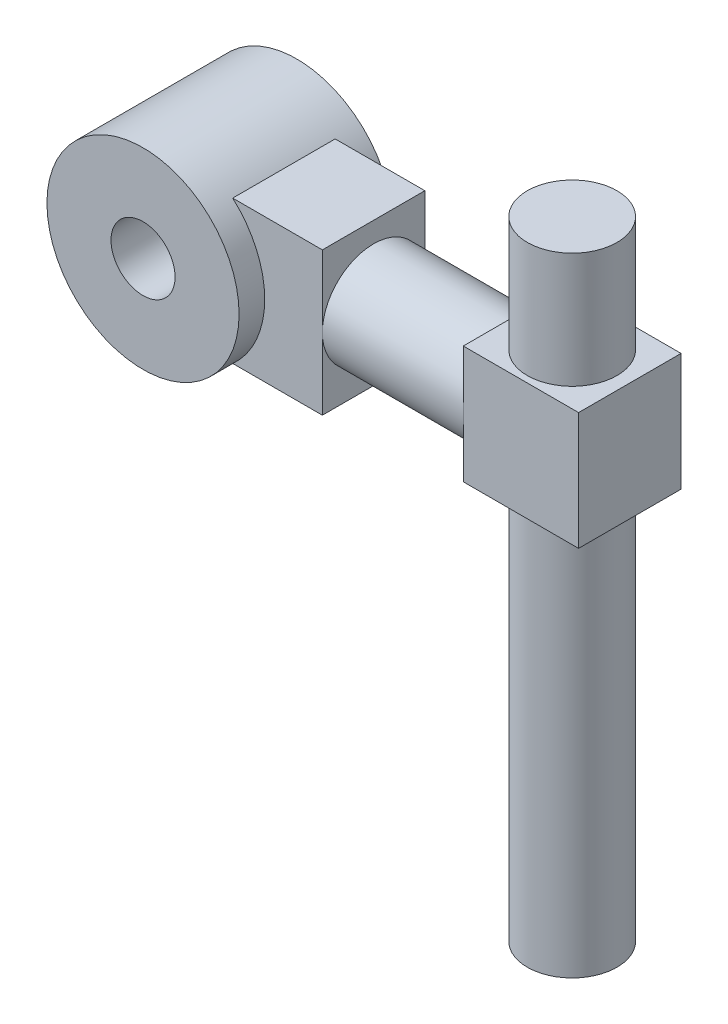
ISO-10303-21;
HEADER;
FILE_DESCRIPTION(('STEP AP214'),'2;1');
FILE_NAME('part.step','',(''),(''),'','','');
FILE_SCHEMA(('AUTOMOTIVE_DESIGN { 1 0 10303 214 1 1 1 1 }'));
ENDSEC;
DATA;
#1=APPLICATION_CONTEXT('core data for automotive mechanical design processes');
#2=APPLICATION_PROTOCOL_DEFINITION('international standard','automotive_design',2000,#1);
#3=PRODUCT_CONTEXT('',#1,'mechanical');
#4=PRODUCT('Part','Part','',(#3));
#5=PRODUCT_RELATED_PRODUCT_CATEGORY('part','',(#4));
#6=PRODUCT_DEFINITION_FORMATION('','',#4);
#7=PRODUCT_DEFINITION_CONTEXT('part definition',#1,'design');
#8=PRODUCT_DEFINITION('design','',#6,#7);
#9=PRODUCT_DEFINITION_SHAPE('','',#8);
#10=(LENGTH_UNIT() NAMED_UNIT(*) SI_UNIT(.MILLI.,.METRE.));
#11=(NAMED_UNIT(*) PLANE_ANGLE_UNIT() SI_UNIT($,.RADIAN.));
#12=(NAMED_UNIT(*) SI_UNIT($,.STERADIAN.) SOLID_ANGLE_UNIT());
#13=UNCERTAINTY_MEASURE_WITH_UNIT(LENGTH_MEASURE(1.E-05),#10,'distance_accuracy_value','');
#14=(GEOMETRIC_REPRESENTATION_CONTEXT(3) GLOBAL_UNCERTAINTY_ASSIGNED_CONTEXT((#13)) GLOBAL_UNIT_ASSIGNED_CONTEXT((#10,
#11,#12)) REPRESENTATION_CONTEXT('',''));
#15=CARTESIAN_POINT('',(0.,0.,0.));
#16=DIRECTION('',(0.,0.,1.));
#17=DIRECTION('',(1.,0.,0.));
#18=AXIS2_PLACEMENT_3D('',#15,#16,#17);
#19=CARTESIAN_POINT('',(60.,0.,0.));
#20=DIRECTION('',(1.,0.,0.));
#21=DIRECTION('',(0.,1.,0.));
#22=AXIS2_PLACEMENT_3D('',#19,#20,#21);
#23=PLANE('',#22);
#24=CARTESIAN_POINT('',(60.,0.,30.));
#25=DIRECTION('',(1.,0.,0.));
#26=DIRECTION('',(0.,1.,0.));
#27=AXIS2_PLACEMENT_3D('',#24,#25,#26);
#28=CIRCLE('',#27,20.);
#29=CARTESIAN_POINT('',(60.,0.,50.));
#30=VERTEX_POINT('',#29);
#31=CARTESIAN_POINT('',(60.,0.,10.));
#32=VERTEX_POINT('',#31);
#33=EDGE_CURVE('E53',#30,#32,#28,.T.);
#34=ORIENTED_EDGE('',*,*,#33,.F.);
#35=DIRECTION('',(0.,-1.,0.));
#36=VECTOR('',#35,1.);
#37=CARTESIAN_POINT('',(60.,27.9508497187474,50.));
#38=LINE('',#37,#36);
#39=CARTESIAN_POINT('',(60.,-27.9508497187474,50.));
#40=VERTEX_POINT('',#39);
#41=EDGE_CURVE('E159',#30,#40,#38,.T.);
#42=ORIENTED_EDGE('',*,*,#41,.T.);
#43=DIRECTION('',(0.,0.,-1.));
#44=VECTOR('',#43,1.);
#45=CARTESIAN_POINT('',(60.,-27.9508497187474,50.));
#46=LINE('',#45,#44);
#47=CARTESIAN_POINT('',(60.,-27.9508497187474,10.));
#48=VERTEX_POINT('',#47);
#49=EDGE_CURVE('E164',#40,#48,#46,.T.);
#50=ORIENTED_EDGE('',*,*,#49,.T.);
#51=DIRECTION('',(0.,1.,0.));
#52=VECTOR('',#51,1.);
#53=CARTESIAN_POINT('',(60.,27.9508497187474,10.));
#54=LINE('',#53,#52);
#55=EDGE_CURVE('E168',#48,#32,#54,.T.);
#56=ORIENTED_EDGE('',*,*,#55,.T.);
#57=EDGE_LOOP('',(#34,#42,#50,#56));
#58=FACE_BOUND('',#57,.T.);
#59=ADVANCED_FACE('F41',(#58),#23,.T.);
#60=CARTESIAN_POINT('',(0.,0.,0.));
#61=DIRECTION('',(0.,0.,1.));
#62=DIRECTION('',(1.,0.,0.));
#63=AXIS2_PLACEMENT_3D('',#60,#61,#62);
#64=PLANE('',#63);
#65=CARTESIAN_POINT('',(0.,0.,0.));
#66=DIRECTION('',(0.,0.,1.));
#67=DIRECTION('',(1.,0.,0.));
#68=AXIS2_PLACEMENT_3D('',#65,#66,#67);
#69=CIRCLE('',#68,37.5);
#70=CARTESIAN_POINT('',(37.5,0.,0.));
#71=VERTEX_POINT('',#70);
#72=EDGE_CURVE('E213',#71,#71,#69,.T.);
#73=ORIENTED_EDGE('',*,*,#72,.F.);
#74=EDGE_LOOP('',(#73));
#75=FACE_BOUND('',#74,.T.);
#76=CARTESIAN_POINT('',(0.,0.,0.));
#77=DIRECTION('',(0.,0.,1.));
#78=DIRECTION('',(1.,0.,0.));
#79=AXIS2_PLACEMENT_3D('',#76,#77,#78);
#80=CIRCLE('',#79,12.5);
#81=CARTESIAN_POINT('',(12.5,0.,0.));
#82=VERTEX_POINT('',#81);
#83=EDGE_CURVE('E209',#82,#82,#80,.T.);
#84=ORIENTED_EDGE('',*,*,#83,.T.);
#85=EDGE_LOOP('',(#84));
#86=FACE_BOUND('',#85,.T.);
#87=ADVANCED_FACE('F222',(#75,#86),#64,.F.);
#88=CARTESIAN_POINT('',(0.,0.,10.));
#89=DIRECTION('',(0.,0.,-1.));
#90=DIRECTION('',(-1.,0.,0.));
#91=AXIS2_PLACEMENT_3D('',#88,#89,#90);
#92=CYLINDRICAL_SURFACE('',#91,37.5);
#93=CARTESIAN_POINT('',(0.,0.,10.));
#94=DIRECTION('',(0.,0.,1.));
#95=DIRECTION('',(1.,0.,0.));
#96=AXIS2_PLACEMENT_3D('',#93,#94,#95);
#97=CIRCLE('',#96,37.5);
#98=CARTESIAN_POINT('',(25.,-27.9508497187474,10.));
#99=VERTEX_POINT('',#98);
#100=CARTESIAN_POINT('',(25.,27.9508497187474,10.));
#101=VERTEX_POINT('',#100);
#102=EDGE_CURVE('E51',#99,#101,#97,.T.);
#103=ORIENTED_EDGE('',*,*,#102,.F.);
#104=DIRECTION('',(0.,0.,-1.));
#105=VECTOR('',#104,1.);
#106=CARTESIAN_POINT('',(25.,-27.9508497187474,50.));
#107=LINE('',#106,#105);
#108=CARTESIAN_POINT('',(25.,-27.9508497187474,50.));
#109=VERTEX_POINT('',#108);
#110=EDGE_CURVE('E206',#109,#99,#107,.T.);
#111=ORIENTED_EDGE('',*,*,#110,.F.);
#112=CARTESIAN_POINT('',(0.,0.,50.));
#113=DIRECTION('',(0.,0.,1.));
#114=DIRECTION('',(1.,0.,0.));
#115=AXIS2_PLACEMENT_3D('',#112,#113,#114);
#116=CIRCLE('',#115,37.5);
#117=CARTESIAN_POINT('',(25.,27.9508497187474,50.));
#118=VERTEX_POINT('',#117);
#119=EDGE_CURVE('E194',#109,#118,#116,.T.);
#120=ORIENTED_EDGE('',*,*,#119,.T.);
#121=DIRECTION('',(0.,0.,-1.));
#122=VECTOR('',#121,1.);
#123=CARTESIAN_POINT('',(25.,27.9508497187474,50.));
#124=LINE('',#123,#122);
#125=EDGE_CURVE('E199',#118,#101,#124,.T.);
#126=ORIENTED_EDGE('',*,*,#125,.T.);
#127=EDGE_LOOP('',(#103,#111,#120,#126));
#128=FACE_BOUND('',#127,.T.);
#129=ORIENTED_EDGE('',*,*,#72,.T.);
#130=EDGE_LOOP('',(#129));
#131=FACE_BOUND('',#130,.T.);
#132=CARTESIAN_POINT('',(0.,0.,60.));
#133=DIRECTION('',(0.,0.,1.));
#134=DIRECTION('',(1.,0.,0.));
#135=AXIS2_PLACEMENT_3D('',#132,#133,#134);
#136=CIRCLE('',#135,37.5);
#137=CARTESIAN_POINT('',(37.5,0.,60.));
#138=VERTEX_POINT('',#137);
#139=EDGE_CURVE('E195',#138,#138,#136,.T.);
#140=ORIENTED_EDGE('',*,*,#139,.F.);
#141=EDGE_LOOP('',(#140));
#142=FACE_BOUND('',#141,.T.);
#143=ADVANCED_FACE('F43',(#128,#131,#142),#92,.T.);
#144=CARTESIAN_POINT('',(0.,0.,10.));
#145=DIRECTION('',(0.,0.,-1.));
#146=DIRECTION('',(-1.,0.,0.));
#147=AXIS2_PLACEMENT_3D('',#144,#145,#146);
#148=CYLINDRICAL_SURFACE('',#147,12.5);
#149=ORIENTED_EDGE('',*,*,#83,.F.);
#150=EDGE_LOOP('',(#149));
#151=FACE_BOUND('',#150,.T.);
#152=CARTESIAN_POINT('',(0.,0.,60.));
#153=DIRECTION('',(0.,0.,1.));
#154=DIRECTION('',(1.,0.,0.));
#155=AXIS2_PLACEMENT_3D('',#152,#153,#154);
#156=CIRCLE('',#155,12.5);
#157=CARTESIAN_POINT('',(12.5,0.,60.));
#158=VERTEX_POINT('',#157);
#159=EDGE_CURVE('E190',#158,#158,#156,.T.);
#160=ORIENTED_EDGE('',*,*,#159,.T.);
#161=EDGE_LOOP('',(#160));
#162=FACE_BOUND('',#161,.T.);
#163=ADVANCED_FACE('F227',(#151,#162),#148,.F.);
#164=CARTESIAN_POINT('',(0.,0.,60.));
#165=DIRECTION('',(0.,0.,1.));
#166=DIRECTION('',(1.,0.,0.));
#167=AXIS2_PLACEMENT_3D('',#164,#165,#166);
#168=PLANE('',#167);
#169=ORIENTED_EDGE('',*,*,#139,.T.);
#170=EDGE_LOOP('',(#169));
#171=FACE_BOUND('',#170,.T.);
#172=ORIENTED_EDGE('',*,*,#159,.F.);
#173=EDGE_LOOP('',(#172));
#174=FACE_BOUND('',#173,.T.);
#175=ADVANCED_FACE('F230',(#171,#174),#168,.T.);
#176=CARTESIAN_POINT('',(60.,27.9508497187474,50.));
#177=DIRECTION('',(0.,0.,-1.));
#178=DIRECTION('',(-1.,0.,0.));
#179=AXIS2_PLACEMENT_3D('',#176,#177,#178);
#180=PLANE('',#179);
#181=DIRECTION('',(-1.,0.,0.));
#182=VECTOR('',#181,1.);
#183=CARTESIAN_POINT('',(60.,27.9508497187474,50.));
#184=LINE('',#183,#182);
#185=CARTESIAN_POINT('',(60.,27.9508497187474,50.));
#186=VERTEX_POINT('',#185);
#187=EDGE_CURVE('E175',#186,#118,#184,.T.);
#188=ORIENTED_EDGE('',*,*,#187,.T.);
#189=ORIENTED_EDGE('',*,*,#119,.F.);
#190=DIRECTION('',(-1.,0.,0.));
#191=VECTOR('',#190,1.);
#192=CARTESIAN_POINT('',(60.,-27.9508497187474,50.));
#193=LINE('',#192,#191);
#194=EDGE_CURVE('E186',#40,#109,#193,.T.);
#195=ORIENTED_EDGE('',*,*,#194,.F.);
#196=ORIENTED_EDGE('',*,*,#41,.F.);
#197=EDGE_CURVE('E161',#186,#30,#38,.T.);
#198=ORIENTED_EDGE('',*,*,#197,.F.);
#199=EDGE_LOOP('',(#188,#189,#195,#196,#198));
#200=FACE_BOUND('',#199,.T.);
#201=ADVANCED_FACE('F235',(#200),#180,.F.);
#202=CARTESIAN_POINT('',(60.,27.9508497187474,10.));
#203=DIRECTION('',(0.,0.,1.));
#204=DIRECTION('',(1.,0.,0.));
#205=AXIS2_PLACEMENT_3D('',#202,#203,#204);
#206=PLANE('',#205);
#207=DIRECTION('',(-1.,0.,0.));
#208=VECTOR('',#207,1.);
#209=CARTESIAN_POINT('',(60.,-27.9508497187474,10.));
#210=LINE('',#209,#208);
#211=EDGE_CURVE('E182',#48,#99,#210,.T.);
#212=ORIENTED_EDGE('',*,*,#211,.T.);
#213=ORIENTED_EDGE('',*,*,#102,.T.);
#214=DIRECTION('',(-1.,0.,0.));
#215=VECTOR('',#214,1.);
#216=CARTESIAN_POINT('',(60.,27.9508497187474,10.));
#217=LINE('',#216,#215);
#218=CARTESIAN_POINT('',(60.,27.9508497187474,10.));
#219=VERTEX_POINT('',#218);
#220=EDGE_CURVE('E179',#219,#101,#217,.T.);
#221=ORIENTED_EDGE('',*,*,#220,.F.);
#222=EDGE_CURVE('E167',#32,#219,#54,.T.);
#223=ORIENTED_EDGE('',*,*,#222,.F.);
#224=ORIENTED_EDGE('',*,*,#55,.F.);
#225=EDGE_LOOP('',(#212,#213,#221,#223,#224));
#226=FACE_BOUND('',#225,.T.);
#227=ADVANCED_FACE('F241',(#226),#206,.F.);
#228=CARTESIAN_POINT('',(60.,-27.9508497187474,50.));
#229=DIRECTION('',(0.,1.,0.));
#230=DIRECTION('',(-1.,0.,0.));
#231=AXIS2_PLACEMENT_3D('',#228,#229,#230);
#232=PLANE('',#231);
#233=ORIENTED_EDGE('',*,*,#110,.T.);
#234=ORIENTED_EDGE('',*,*,#211,.F.);
#235=ORIENTED_EDGE('',*,*,#49,.F.);
#236=ORIENTED_EDGE('',*,*,#194,.T.);
#237=EDGE_LOOP('',(#233,#234,#235,#236));
#238=FACE_BOUND('',#237,.T.);
#239=ADVANCED_FACE('F261',(#238),#232,.F.);
#240=CARTESIAN_POINT('',(60.,27.9508497187474,50.));
#241=DIRECTION('',(0.,-1.,0.));
#242=DIRECTION('',(1.,0.,0.));
#243=AXIS2_PLACEMENT_3D('',#240,#241,#242);
#244=PLANE('',#243);
#245=ORIENTED_EDGE('',*,*,#125,.F.);
#246=ORIENTED_EDGE('',*,*,#187,.F.);
#247=DIRECTION('',(0.,0.,1.));
#248=VECTOR('',#247,1.);
#249=CARTESIAN_POINT('',(60.,27.9508497187474,50.));
#250=LINE('',#249,#248);
#251=EDGE_CURVE('E172',#219,#186,#250,.T.);
#252=ORIENTED_EDGE('',*,*,#251,.F.);
#253=ORIENTED_EDGE('',*,*,#220,.T.);
#254=EDGE_LOOP('',(#245,#246,#252,#253));
#255=FACE_BOUND('',#254,.T.);
#256=ADVANCED_FACE('F255',(#255),#244,.F.);
#257=EDGE_CURVE('E11',#32,#30,#28,.T.);
#258=ORIENTED_EDGE('',*,*,#257,.F.);
#259=ORIENTED_EDGE('',*,*,#222,.T.);
#260=ORIENTED_EDGE('',*,*,#251,.T.);
#261=ORIENTED_EDGE('',*,*,#197,.T.);
#262=EDGE_LOOP('',(#258,#259,#260,#261));
#263=FACE_BOUND('',#262,.T.);
#264=ADVANCED_FACE('F247',(#263),#23,.T.);
#265=CARTESIAN_POINT('',(115.,0.,30.));
#266=DIRECTION('',(-1.,0.,0.));
#267=DIRECTION('',(0.,-1.,0.));
#268=AXIS2_PLACEMENT_3D('',#265,#266,#267);
#269=CYLINDRICAL_SURFACE('',#268,20.);
#270=CARTESIAN_POINT('',(115.,0.,30.));
#271=DIRECTION('',(1.,0.,0.));
#272=DIRECTION('',(0.,1.,0.));
#273=AXIS2_PLACEMENT_3D('',#270,#271,#272);
#274=CIRCLE('',#273,20.);
#275=CARTESIAN_POINT('',(115.,0.,50.));
#276=VERTEX_POINT('',#275);
#277=CARTESIAN_POINT('',(115.,0.,10.));
#278=VERTEX_POINT('',#277);
#279=EDGE_CURVE('E157',#276,#278,#274,.T.);
#280=ORIENTED_EDGE('',*,*,#279,.F.);
#281=EDGE_CURVE('E59',#278,#276,#274,.T.);
#282=ORIENTED_EDGE('',*,*,#281,.F.);
#283=EDGE_LOOP('',(#280,#282));
#284=FACE_BOUND('',#283,.T.);
#285=ORIENTED_EDGE('',*,*,#33,.T.);
#286=ORIENTED_EDGE('',*,*,#257,.T.);
#287=EDGE_LOOP('',(#285,#286));
#288=FACE_BOUND('',#287,.T.);
#289=ADVANCED_FACE('F254',(#284,#288),#269,.T.);
#290=CARTESIAN_POINT('',(115.,0.,0.));
#291=DIRECTION('',(1.,0.,0.));
#292=DIRECTION('',(0.,0.,-1.));
#293=AXIS2_PLACEMENT_3D('',#290,#291,#292);
#294=PLANE('',#293);
#295=DIRECTION('',(0.,-1.,0.));
#296=VECTOR('',#295,1.);
#297=CARTESIAN_POINT('',(115.,22.9508497187474,50.));
#298=LINE('',#297,#296);
#299=CARTESIAN_POINT('',(115.,-22.9508497187474,50.));
#300=VERTEX_POINT('',#299);
#301=EDGE_CURVE('E146',#276,#300,#298,.T.);
#302=ORIENTED_EDGE('',*,*,#301,.F.);
#303=ORIENTED_EDGE('',*,*,#279,.T.);
#304=DIRECTION('',(0.,1.,0.));
#305=VECTOR('',#304,1.);
#306=CARTESIAN_POINT('',(115.,22.9508497187474,10.));
#307=LINE('',#306,#305);
#308=CARTESIAN_POINT('',(115.,-22.9508497187474,10.));
#309=VERTEX_POINT('',#308);
#310=EDGE_CURVE('E309',#309,#278,#307,.T.);
#311=ORIENTED_EDGE('',*,*,#310,.F.);
#312=DIRECTION('',(0.,0.,-1.));
#313=VECTOR('',#312,1.);
#314=CARTESIAN_POINT('',(115.,-22.9508497187474,50.));
#315=LINE('',#314,#313);
#316=EDGE_CURVE('E298',#300,#309,#315,.T.);
#317=ORIENTED_EDGE('',*,*,#316,.F.);
#318=EDGE_LOOP('',(#302,#303,#311,#317));
#319=FACE_BOUND('',#318,.T.);
#320=ADVANCED_FACE('F260',(#319),#294,.F.);
#321=CARTESIAN_POINT('',(115.,22.9508497187474,10.));
#322=VERTEX_POINT('',#321);
#323=EDGE_CURVE('E294',#278,#322,#307,.T.);
#324=ORIENTED_EDGE('',*,*,#323,.F.);
#325=ORIENTED_EDGE('',*,*,#281,.T.);
#326=CARTESIAN_POINT('',(115.,22.9508497187474,50.));
#327=VERTEX_POINT('',#326);
#328=EDGE_CURVE('E293',#327,#276,#298,.T.);
#329=ORIENTED_EDGE('',*,*,#328,.F.);
#330=DIRECTION('',(0.,0.,1.));
#331=VECTOR('',#330,1.);
#332=CARTESIAN_POINT('',(115.,22.9508497187474,50.));
#333=LINE('',#332,#331);
#334=EDGE_CURVE('E141',#322,#327,#333,.T.);
#335=ORIENTED_EDGE('',*,*,#334,.F.);
#336=EDGE_LOOP('',(#324,#325,#329,#335));
#337=FACE_BOUND('',#336,.T.);
#338=ADVANCED_FACE('F291',(#337),#294,.F.);
#339=CARTESIAN_POINT('',(160.,22.9508497187474,50.));
#340=DIRECTION('',(0.,0.,-1.));
#341=DIRECTION('',(0.,1.,0.));
#342=AXIS2_PLACEMENT_3D('',#339,#340,#341);
#343=PLANE('',#342);
#344=ORIENTED_EDGE('',*,*,#328,.T.);
#345=ORIENTED_EDGE('',*,*,#301,.T.);
#346=DIRECTION('',(-1.,0.,0.));
#347=VECTOR('',#346,1.);
#348=CARTESIAN_POINT('',(160.,-22.9508497187474,50.));
#349=LINE('',#348,#347);
#350=CARTESIAN_POINT('',(160.,-22.9508497187474,50.));
#351=VERTEX_POINT('',#350);
#352=EDGE_CURVE('E124',#351,#300,#349,.T.);
#353=ORIENTED_EDGE('',*,*,#352,.F.);
#354=DIRECTION('',(0.,-1.,0.));
#355=VECTOR('',#354,1.);
#356=CARTESIAN_POINT('',(160.,22.9508497187474,50.));
#357=LINE('',#356,#355);
#358=CARTESIAN_POINT('',(160.,22.9508497187474,50.));
#359=VERTEX_POINT('',#358);
#360=EDGE_CURVE('E131',#359,#351,#357,.T.);
#361=ORIENTED_EDGE('',*,*,#360,.F.);
#362=DIRECTION('',(-1.,0.,0.));
#363=VECTOR('',#362,1.);
#364=CARTESIAN_POINT('',(160.,22.9508497187474,50.));
#365=LINE('',#364,#363);
#366=EDGE_CURVE('E302',#359,#327,#365,.T.);
#367=ORIENTED_EDGE('',*,*,#366,.T.);
#368=EDGE_LOOP('',(#344,#345,#353,#361,#367));
#369=FACE_BOUND('',#368,.T.);
#370=ADVANCED_FACE('F144',(#369),#343,.F.);
#371=CARTESIAN_POINT('',(160.,-22.9508497187474,50.));
#372=DIRECTION('',(0.,1.,0.));
#373=DIRECTION('',(-1.,0.,0.));
#374=AXIS2_PLACEMENT_3D('',#371,#372,#373);
#375=PLANE('',#374);
#376=CARTESIAN_POINT('',(137.5,-22.9508497187474,30.));
#377=DIRECTION('',(0.,1.,0.));
#378=DIRECTION('',(-1.,0.,0.));
#379=AXIS2_PLACEMENT_3D('',#376,#377,#378);
#380=CIRCLE('',#379,17.5);
#381=CARTESIAN_POINT('',(120.,-22.9508497187474,30.));
#382=VERTEX_POINT('',#381);
#383=EDGE_CURVE('E300',#382,#382,#380,.T.);
#384=ORIENTED_EDGE('',*,*,#383,.T.);
#385=EDGE_LOOP('',(#384));
#386=FACE_BOUND('',#385,.T.);
#387=ORIENTED_EDGE('',*,*,#316,.T.);
#388=DIRECTION('',(-1.,0.,0.));
#389=VECTOR('',#388,1.);
#390=CARTESIAN_POINT('',(160.,-22.9508497187474,10.));
#391=LINE('',#390,#389);
#392=CARTESIAN_POINT('',(160.,-22.9508497187474,10.));
#393=VERTEX_POINT('',#392);
#394=EDGE_CURVE('E126',#393,#309,#391,.T.);
#395=ORIENTED_EDGE('',*,*,#394,.F.);
#396=DIRECTION('',(0.,0.,-1.));
#397=VECTOR('',#396,1.);
#398=CARTESIAN_POINT('',(160.,-22.9508497187474,50.));
#399=LINE('',#398,#397);
#400=EDGE_CURVE('E120',#351,#393,#399,.T.);
#401=ORIENTED_EDGE('',*,*,#400,.F.);
#402=ORIENTED_EDGE('',*,*,#352,.T.);
#403=EDGE_LOOP('',(#387,#395,#401,#402));
#404=FACE_BOUND('',#403,.T.);
#405=ADVANCED_FACE('F122',(#386,#404),#375,.F.);
#406=CARTESIAN_POINT('',(160.,22.9508497187474,10.));
#407=DIRECTION('',(0.,0.,1.));
#408=DIRECTION('',(1.,0.,0.));
#409=AXIS2_PLACEMENT_3D('',#406,#407,#408);
#410=PLANE('',#409);
#411=ORIENTED_EDGE('',*,*,#310,.T.);
#412=ORIENTED_EDGE('',*,*,#323,.T.);
#413=DIRECTION('',(-1.,0.,0.));
#414=VECTOR('',#413,1.);
#415=CARTESIAN_POINT('',(160.,22.9508497187474,10.));
#416=LINE('',#415,#414);
#417=CARTESIAN_POINT('',(160.,22.9508497187474,10.));
#418=VERTEX_POINT('',#417);
#419=EDGE_CURVE('E153',#418,#322,#416,.T.);
#420=ORIENTED_EDGE('',*,*,#419,.F.);
#421=DIRECTION('',(0.,1.,0.));
#422=VECTOR('',#421,1.);
#423=CARTESIAN_POINT('',(160.,22.9508497187474,10.));
#424=LINE('',#423,#422);
#425=EDGE_CURVE('E130',#393,#418,#424,.T.);
#426=ORIENTED_EDGE('',*,*,#425,.F.);
#427=ORIENTED_EDGE('',*,*,#394,.T.);
#428=EDGE_LOOP('',(#411,#412,#420,#426,#427));
#429=FACE_BOUND('',#428,.T.);
#430=ADVANCED_FACE('F321',(#429),#410,.F.);
#431=CARTESIAN_POINT('',(160.,22.9508497187474,50.));
#432=DIRECTION('',(0.,-1.,0.));
#433=DIRECTION('',(1.,0.,0.));
#434=AXIS2_PLACEMENT_3D('',#431,#432,#433);
#435=PLANE('',#434);
#436=CARTESIAN_POINT('',(137.5,22.9508497187474,30.));
#437=DIRECTION('',(0.,-1.,0.));
#438=DIRECTION('',(1.,0.,0.));
#439=AXIS2_PLACEMENT_3D('',#436,#437,#438);
#440=CIRCLE('',#439,17.5);
#441=CARTESIAN_POINT('',(155.,22.9508497187474,30.));
#442=VERTEX_POINT('',#441);
#443=EDGE_CURVE('E45',#442,#442,#440,.T.);
#444=ORIENTED_EDGE('',*,*,#443,.T.);
#445=EDGE_LOOP('',(#444));
#446=FACE_BOUND('',#445,.T.);
#447=ORIENTED_EDGE('',*,*,#334,.T.);
#448=ORIENTED_EDGE('',*,*,#366,.F.);
#449=DIRECTION('',(0.,0.,1.));
#450=VECTOR('',#449,1.);
#451=CARTESIAN_POINT('',(160.,22.9508497187474,50.));
#452=LINE('',#451,#450);
#453=EDGE_CURVE('E136',#418,#359,#452,.T.);
#454=ORIENTED_EDGE('',*,*,#453,.F.);
#455=ORIENTED_EDGE('',*,*,#419,.T.);
#456=EDGE_LOOP('',(#447,#448,#454,#455));
#457=FACE_BOUND('',#456,.T.);
#458=ADVANCED_FACE('F319',(#446,#457),#435,.F.);
#459=CARTESIAN_POINT('',(160.,0.,0.));
#460=DIRECTION('',(1.,0.,0.));
#461=DIRECTION('',(0.,0.,-1.));
#462=AXIS2_PLACEMENT_3D('',#459,#460,#461);
#463=PLANE('',#462);
#464=ORIENTED_EDGE('',*,*,#360,.T.);
#465=ORIENTED_EDGE('',*,*,#400,.T.);
#466=ORIENTED_EDGE('',*,*,#425,.T.);
#467=ORIENTED_EDGE('',*,*,#453,.T.);
#468=EDGE_LOOP('',(#464,#465,#466,#467));
#469=FACE_BOUND('',#468,.T.);
#470=ADVANCED_FACE('F134',(#469),#463,.T.);
#471=CARTESIAN_POINT('',(137.5,67.9508497187474,30.));
#472=DIRECTION('',(0.,1.,0.));
#473=DIRECTION('',(-1.,0.,0.));
#474=AXIS2_PLACEMENT_3D('',#471,#472,#473);
#475=PLANE('',#474);
#476=CARTESIAN_POINT('',(137.5,67.9508497187474,30.));
#477=DIRECTION('',(0.,1.,0.));
#478=DIRECTION('',(-1.,0.,0.));
#479=AXIS2_PLACEMENT_3D('',#476,#477,#478);
#480=CIRCLE('',#479,17.5);
#481=CARTESIAN_POINT('',(120.,67.9508497187474,30.));
#482=VERTEX_POINT('',#481);
#483=EDGE_CURVE('E333',#482,#482,#480,.T.);
#484=ORIENTED_EDGE('',*,*,#483,.T.);
#485=EDGE_LOOP('',(#484));
#486=FACE_BOUND('',#485,.T.);
#487=ADVANCED_FACE('F338',(#486),#475,.T.);
#488=CARTESIAN_POINT('',(137.5,-177.049150281253,30.));
#489=DIRECTION('',(0.,1.,0.));
#490=DIRECTION('',(-1.,0.,0.));
#491=AXIS2_PLACEMENT_3D('',#488,#489,#490);
#492=CYLINDRICAL_SURFACE('',#491,17.5);
#493=ORIENTED_EDGE('',*,*,#483,.F.);
#494=EDGE_LOOP('',(#493));
#495=FACE_BOUND('',#494,.T.);
#496=ORIENTED_EDGE('',*,*,#443,.F.);
#497=EDGE_LOOP('',(#496));
#498=FACE_BOUND('',#497,.T.);
#499=ADVANCED_FACE('F340',(#495,#498),#492,.T.);
#500=CARTESIAN_POINT('',(137.5,-177.049150281253,30.));
#501=DIRECTION('',(0.,1.,0.));
#502=DIRECTION('',(-1.,0.,0.));
#503=AXIS2_PLACEMENT_3D('',#500,#501,#502);
#504=CIRCLE('',#503,17.5);
#505=CARTESIAN_POINT('',(120.,-177.049150281253,30.));
#506=VERTEX_POINT('',#505);
#507=EDGE_CURVE('E329',#506,#506,#504,.T.);
#508=ORIENTED_EDGE('',*,*,#507,.T.);
#509=EDGE_LOOP('',(#508));
#510=FACE_BOUND('',#509,.T.);
#511=ORIENTED_EDGE('',*,*,#383,.F.);
#512=EDGE_LOOP('',(#511));
#513=FACE_BOUND('',#512,.T.);
#514=ADVANCED_FACE('F343',(#510,#513),#492,.T.);
#515=CARTESIAN_POINT('',(137.5,-177.049150281253,30.));
#516=DIRECTION('',(0.,1.,0.));
#517=DIRECTION('',(-1.,0.,0.));
#518=AXIS2_PLACEMENT_3D('',#515,#516,#517);
#519=PLANE('',#518);
#520=ORIENTED_EDGE('',*,*,#507,.F.);
#521=EDGE_LOOP('',(#520));
#522=FACE_BOUND('',#521,.T.);
#523=ADVANCED_FACE('F489',(#522),#519,.F.);
#524=CLOSED_SHELL('',(#59,#87,#143,#163,#175,#201,#227,#239,#256,#264,#289,#320,#338,#370,#405,
#430,#458,#470,#487,#499,#514,#523));
#525=MANIFOLD_SOLID_BREP('B2',#524);
#526=ADVANCED_BREP_SHAPE_REPRESENTATION('',(#18,#525),#14);
#527=SHAPE_DEFINITION_REPRESENTATION(#9,#526);
ENDSEC;
END-ISO-10303-21;
